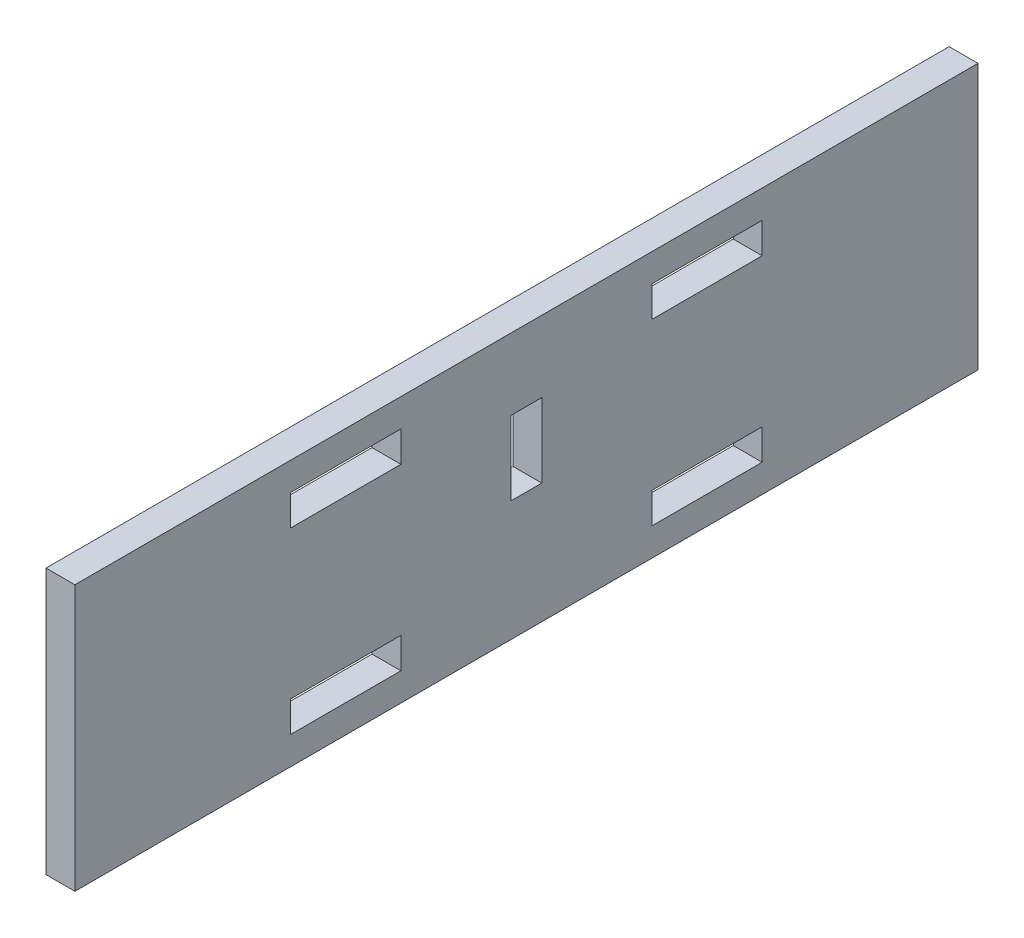
ISO-10303-21;
HEADER;
FILE_DESCRIPTION(('STEP AP214'),'2;1');
FILE_NAME('part.step','',(''),(''),'','','');
FILE_SCHEMA(('AUTOMOTIVE_DESIGN { 1 0 10303 214 1 1 1 1 }'));
ENDSEC;
DATA;
#1=APPLICATION_CONTEXT('core data for automotive mechanical design processes');
#2=APPLICATION_PROTOCOL_DEFINITION('international standard','automotive_design',2000,#1);
#3=PRODUCT_CONTEXT('',#1,'mechanical');
#4=PRODUCT('Part','Part','',(#3));
#5=PRODUCT_RELATED_PRODUCT_CATEGORY('part','',(#4));
#6=PRODUCT_DEFINITION_FORMATION('','',#4);
#7=PRODUCT_DEFINITION_CONTEXT('part definition',#1,'design');
#8=PRODUCT_DEFINITION('design','',#6,#7);
#9=PRODUCT_DEFINITION_SHAPE('','',#8);
#10=(LENGTH_UNIT() NAMED_UNIT(*) SI_UNIT(.MILLI.,.METRE.));
#11=(NAMED_UNIT(*) PLANE_ANGLE_UNIT() SI_UNIT($,.RADIAN.));
#12=(NAMED_UNIT(*) SI_UNIT($,.STERADIAN.) SOLID_ANGLE_UNIT());
#13=UNCERTAINTY_MEASURE_WITH_UNIT(LENGTH_MEASURE(1.E-05),#10,'distance_accuracy_value','');
#14=(GEOMETRIC_REPRESENTATION_CONTEXT(3) GLOBAL_UNCERTAINTY_ASSIGNED_CONTEXT((#13)) GLOBAL_UNIT_ASSIGNED_CONTEXT((#10,
#11,#12)) REPRESENTATION_CONTEXT('',''));
#15=CARTESIAN_POINT('',(0.,0.,0.));
#16=DIRECTION('',(0.,0.,1.));
#17=DIRECTION('',(1.,0.,0.));
#18=AXIS2_PLACEMENT_3D('',#15,#16,#17);
#19=CARTESIAN_POINT('',(-342.5,-16.,125.));
#20=DIRECTION('',(0.,0.,-1.));
#21=DIRECTION('',(1.,0.,0.));
#22=AXIS2_PLACEMENT_3D('',#19,#20,#21);
#23=PLANE('',#22);
#24=DIRECTION('',(0.,-1.,0.));
#25=VECTOR('',#24,1.);
#26=CARTESIAN_POINT('',(-334.5,-16.,125.));
#27=LINE('',#26,#25);
#28=CARTESIAN_POINT('',(-334.5,57.5,125.));
#29=VERTEX_POINT('',#28);
#30=CARTESIAN_POINT('',(-334.5,-16.,125.));
#31=VERTEX_POINT('',#30);
#32=EDGE_CURVE('E301',#29,#31,#27,.T.);
#33=ORIENTED_EDGE('',*,*,#32,.F.);
#34=DIRECTION('',(1.,0.,0.));
#35=VECTOR('',#34,1.);
#36=CARTESIAN_POINT('',(-342.5,57.5,125.));
#37=LINE('',#36,#35);
#38=CARTESIAN_POINT('',(-342.5,57.5,125.));
#39=VERTEX_POINT('',#38);
#40=EDGE_CURVE('E319',#39,#29,#37,.T.);
#41=ORIENTED_EDGE('',*,*,#40,.F.);
#42=DIRECTION('',(0.,-1.,0.));
#43=VECTOR('',#42,1.);
#44=CARTESIAN_POINT('',(-342.5,-16.,125.));
#45=LINE('',#44,#43);
#46=CARTESIAN_POINT('',(-342.5,-16.,125.));
#47=VERTEX_POINT('',#46);
#48=EDGE_CURVE('E307',#39,#47,#45,.T.);
#49=ORIENTED_EDGE('',*,*,#48,.T.);
#50=DIRECTION('',(1.,0.,0.));
#51=VECTOR('',#50,1.);
#52=CARTESIAN_POINT('',(-342.5,-16.,125.));
#53=LINE('',#52,#51);
#54=EDGE_CURVE('E337',#47,#31,#53,.T.);
#55=ORIENTED_EDGE('',*,*,#54,.T.);
#56=EDGE_LOOP('',(#33,#41,#49,#55));
#57=FACE_BOUND('',#56,.T.);
#58=ADVANCED_FACE('F38',(#57),#23,.F.);
#59=CARTESIAN_POINT('',(-342.5,-16.,125.));
#60=DIRECTION('',(0.,1.,0.));
#61=DIRECTION('',(0.,0.,1.));
#62=AXIS2_PLACEMENT_3D('',#59,#60,#61);
#63=PLANE('',#62);
#64=DIRECTION('',(0.,0.,-1.));
#65=VECTOR('',#64,1.);
#66=CARTESIAN_POINT('',(-334.5,-16.,125.));
#67=LINE('',#66,#65);
#68=CARTESIAN_POINT('',(-334.5,-16.,-125.));
#69=VERTEX_POINT('',#68);
#70=EDGE_CURVE('E322',#31,#69,#67,.T.);
#71=ORIENTED_EDGE('',*,*,#70,.F.);
#72=ORIENTED_EDGE('',*,*,#54,.F.);
#73=DIRECTION('',(0.,0.,-1.));
#74=VECTOR('',#73,1.);
#75=CARTESIAN_POINT('',(-342.5,-16.,125.));
#76=LINE('',#75,#74);
#77=CARTESIAN_POINT('',(-342.5,-16.,-125.));
#78=VERTEX_POINT('',#77);
#79=EDGE_CURVE('E310',#47,#78,#76,.T.);
#80=ORIENTED_EDGE('',*,*,#79,.T.);
#81=DIRECTION('',(1.,0.,0.));
#82=VECTOR('',#81,1.);
#83=CARTESIAN_POINT('',(-342.5,-16.,-125.));
#84=LINE('',#83,#82);
#85=EDGE_CURVE('E334',#78,#69,#84,.T.);
#86=ORIENTED_EDGE('',*,*,#85,.T.);
#87=EDGE_LOOP('',(#71,#72,#80,#86));
#88=FACE_BOUND('',#87,.T.);
#89=ADVANCED_FACE('F412',(#88),#63,.F.);
#90=CARTESIAN_POINT('',(-342.5,-16.,-125.));
#91=DIRECTION('',(0.,0.,1.));
#92=DIRECTION('',(-1.,0.,0.));
#93=AXIS2_PLACEMENT_3D('',#90,#91,#92);
#94=PLANE('',#93);
#95=DIRECTION('',(0.,1.,0.));
#96=VECTOR('',#95,1.);
#97=CARTESIAN_POINT('',(-334.5,-16.,-125.));
#98=LINE('',#97,#96);
#99=CARTESIAN_POINT('',(-334.5,57.5,-125.));
#100=VERTEX_POINT('',#99);
#101=EDGE_CURVE('E325',#69,#100,#98,.T.);
#102=ORIENTED_EDGE('',*,*,#101,.F.);
#103=ORIENTED_EDGE('',*,*,#85,.F.);
#104=DIRECTION('',(0.,1.,0.));
#105=VECTOR('',#104,1.);
#106=CARTESIAN_POINT('',(-342.5,-16.,-125.));
#107=LINE('',#106,#105);
#108=CARTESIAN_POINT('',(-342.5,57.5,-125.));
#109=VERTEX_POINT('',#108);
#110=EDGE_CURVE('E314',#78,#109,#107,.T.);
#111=ORIENTED_EDGE('',*,*,#110,.T.);
#112=DIRECTION('',(1.,0.,0.));
#113=VECTOR('',#112,1.);
#114=CARTESIAN_POINT('',(-342.5,57.5,-125.));
#115=LINE('',#114,#113);
#116=EDGE_CURVE('E331',#109,#100,#115,.T.);
#117=ORIENTED_EDGE('',*,*,#116,.T.);
#118=EDGE_LOOP('',(#102,#103,#111,#117));
#119=FACE_BOUND('',#118,.T.);
#120=ADVANCED_FACE('F417',(#119),#94,.F.);
#121=CARTESIAN_POINT('',(-342.5,57.5,125.));
#122=DIRECTION('',(0.,-1.,0.));
#123=DIRECTION('',(0.,0.,-1.));
#124=AXIS2_PLACEMENT_3D('',#121,#122,#123);
#125=PLANE('',#124);
#126=DIRECTION('',(0.,0.,1.));
#127=VECTOR('',#126,1.);
#128=CARTESIAN_POINT('',(-334.5,57.5,125.));
#129=LINE('',#128,#127);
#130=EDGE_CURVE('E311',#100,#29,#129,.T.);
#131=ORIENTED_EDGE('',*,*,#130,.F.);
#132=ORIENTED_EDGE('',*,*,#116,.F.);
#133=DIRECTION('',(0.,0.,1.));
#134=VECTOR('',#133,1.);
#135=CARTESIAN_POINT('',(-342.5,57.5,125.));
#136=LINE('',#135,#134);
#137=EDGE_CURVE('E317',#109,#39,#136,.T.);
#138=ORIENTED_EDGE('',*,*,#137,.T.);
#139=ORIENTED_EDGE('',*,*,#40,.T.);
#140=EDGE_LOOP('',(#131,#132,#138,#139));
#141=FACE_BOUND('',#140,.T.);
#142=ADVANCED_FACE('F425',(#141),#125,.F.);
#143=CARTESIAN_POINT('',(-342.5,0.,0.));
#144=DIRECTION('',(1.,0.,0.));
#145=DIRECTION('',(0.,0.,1.));
#146=AXIS2_PLACEMENT_3D('',#143,#144,#145);
#147=PLANE('',#146);
#148=DIRECTION('',(0.,0.,1.));
#149=VECTOR('',#148,1.);
#150=CARTESIAN_POINT('',(-342.5,37.75,-4.25));
#151=LINE('',#150,#149);
#152=CARTESIAN_POINT('',(-342.5,37.75,-4.25));
#153=VERTEX_POINT('',#152);
#154=CARTESIAN_POINT('',(-342.5,37.75,4.25));
#155=VERTEX_POINT('',#154);
#156=EDGE_CURVE('E201',#153,#155,#151,.T.);
#157=ORIENTED_EDGE('',*,*,#156,.T.);
#158=DIRECTION('',(0.,-1.,0.));
#159=VECTOR('',#158,1.);
#160=CARTESIAN_POINT('',(-342.5,17.25,4.25));
#161=LINE('',#160,#159);
#162=CARTESIAN_POINT('',(-342.5,17.25,4.25));
#163=VERTEX_POINT('',#162);
#164=EDGE_CURVE('E208',#155,#163,#161,.T.);
#165=ORIENTED_EDGE('',*,*,#164,.T.);
#166=DIRECTION('',(0.,0.,-1.));
#167=VECTOR('',#166,1.);
#168=CARTESIAN_POINT('',(-342.5,17.25,-4.25));
#169=LINE('',#168,#167);
#170=CARTESIAN_POINT('',(-342.5,17.25,-4.25));
#171=VERTEX_POINT('',#170);
#172=EDGE_CURVE('E213',#163,#171,#169,.T.);
#173=ORIENTED_EDGE('',*,*,#172,.T.);
#174=DIRECTION('',(0.,1.,0.));
#175=VECTOR('',#174,1.);
#176=CARTESIAN_POINT('',(-342.5,17.25,-4.25));
#177=LINE('',#176,#175);
#178=EDGE_CURVE('E217',#171,#153,#177,.T.);
#179=ORIENTED_EDGE('',*,*,#178,.T.);
#180=EDGE_LOOP('',(#157,#165,#173,#179));
#181=FACE_BOUND('',#180,.T.);
#182=DIRECTION('',(0.,1.,0.));
#183=VECTOR('',#182,1.);
#184=CARTESIAN_POINT('',(-342.5,41.25,34.75));
#185=LINE('',#184,#183);
#186=CARTESIAN_POINT('',(-342.5,41.25,34.75));
#187=VERTEX_POINT('',#186);
#188=CARTESIAN_POINT('',(-342.5,49.75,34.75));
#189=VERTEX_POINT('',#188);
#190=EDGE_CURVE('E229',#187,#189,#185,.T.);
#191=ORIENTED_EDGE('',*,*,#190,.T.);
#192=DIRECTION('',(0.,0.,1.));
#193=VECTOR('',#192,1.);
#194=CARTESIAN_POINT('',(-342.5,49.75,65.25));
#195=LINE('',#194,#193);
#196=CARTESIAN_POINT('',(-342.5,49.75,65.25));
#197=VERTEX_POINT('',#196);
#198=EDGE_CURVE('E232',#189,#197,#195,.T.);
#199=ORIENTED_EDGE('',*,*,#198,.T.);
#200=DIRECTION('',(0.,-1.,0.));
#201=VECTOR('',#200,1.);
#202=CARTESIAN_POINT('',(-342.5,41.25,65.25));
#203=LINE('',#202,#201);
#204=CARTESIAN_POINT('',(-342.5,41.25,65.25));
#205=VERTEX_POINT('',#204);
#206=EDGE_CURVE('E235',#197,#205,#203,.T.);
#207=ORIENTED_EDGE('',*,*,#206,.T.);
#208=DIRECTION('',(0.,0.,-1.));
#209=VECTOR('',#208,1.);
#210=CARTESIAN_POINT('',(-342.5,41.25,65.25));
#211=LINE('',#210,#209);
#212=EDGE_CURVE('E224',#205,#187,#211,.T.);
#213=ORIENTED_EDGE('',*,*,#212,.T.);
#214=EDGE_LOOP('',(#191,#199,#207,#213));
#215=FACE_BOUND('',#214,.T.);
#216=DIRECTION('',(0.,0.,1.));
#217=VECTOR('',#216,1.);
#218=CARTESIAN_POINT('',(-342.5,49.75,-65.25));
#219=LINE('',#218,#217);
#220=CARTESIAN_POINT('',(-342.5,49.75,-65.25));
#221=VERTEX_POINT('',#220);
#222=CARTESIAN_POINT('',(-342.5,49.75,-34.75));
#223=VERTEX_POINT('',#222);
#224=EDGE_CURVE('E249',#221,#223,#219,.T.);
#225=ORIENTED_EDGE('',*,*,#224,.T.);
#226=DIRECTION('',(0.,-1.,0.));
#227=VECTOR('',#226,1.);
#228=CARTESIAN_POINT('',(-342.5,41.25,-34.75));
#229=LINE('',#228,#227);
#230=CARTESIAN_POINT('',(-342.5,41.25,-34.75));
#231=VERTEX_POINT('',#230);
#232=EDGE_CURVE('E252',#223,#231,#229,.T.);
#233=ORIENTED_EDGE('',*,*,#232,.T.);
#234=DIRECTION('',(0.,0.,-1.));
#235=VECTOR('',#234,1.);
#236=CARTESIAN_POINT('',(-342.5,41.25,-65.25));
#237=LINE('',#236,#235);
#238=CARTESIAN_POINT('',(-342.5,41.25,-65.25));
#239=VERTEX_POINT('',#238);
#240=EDGE_CURVE('E255',#231,#239,#237,.T.);
#241=ORIENTED_EDGE('',*,*,#240,.T.);
#242=DIRECTION('',(0.,1.,0.));
#243=VECTOR('',#242,1.);
#244=CARTESIAN_POINT('',(-342.5,41.25,-65.25));
#245=LINE('',#244,#243);
#246=EDGE_CURVE('E241',#239,#221,#245,.T.);
#247=ORIENTED_EDGE('',*,*,#246,.T.);
#248=EDGE_LOOP('',(#225,#233,#241,#247));
#249=FACE_BOUND('',#248,.T.);
#250=DIRECTION('',(0.,-1.,0.));
#251=VECTOR('',#250,1.);
#252=CARTESIAN_POINT('',(-342.5,0.25000000000002,-34.75));
#253=LINE('',#252,#251);
#254=CARTESIAN_POINT('',(-342.5,0.25000000000002,-34.75));
#255=VERTEX_POINT('',#254);
#256=CARTESIAN_POINT('',(-342.5,-8.24999999999998,-34.75));
#257=VERTEX_POINT('',#256);
#258=EDGE_CURVE('E269',#255,#257,#253,.T.);
#259=ORIENTED_EDGE('',*,*,#258,.T.);
#260=DIRECTION('',(0.,0.,-1.));
#261=VECTOR('',#260,1.);
#262=CARTESIAN_POINT('',(-342.5,-8.24999999999999,-65.25));
#263=LINE('',#262,#261);
#264=CARTESIAN_POINT('',(-342.5,-8.24999999999999,-65.25));
#265=VERTEX_POINT('',#264);
#266=EDGE_CURVE('E272',#257,#265,#263,.T.);
#267=ORIENTED_EDGE('',*,*,#266,.T.);
#268=DIRECTION('',(0.,1.,0.));
#269=VECTOR('',#268,1.);
#270=CARTESIAN_POINT('',(-342.5,0.250000000000012,-65.25));
#271=LINE('',#270,#269);
#272=CARTESIAN_POINT('',(-342.5,0.250000000000012,-65.25));
#273=VERTEX_POINT('',#272);
#274=EDGE_CURVE('E275',#265,#273,#271,.T.);
#275=ORIENTED_EDGE('',*,*,#274,.T.);
#276=DIRECTION('',(0.,0.,1.));
#277=VECTOR('',#276,1.);
#278=CARTESIAN_POINT('',(-342.5,0.250000000000012,-65.25));
#279=LINE('',#278,#277);
#280=EDGE_CURVE('E261',#273,#255,#279,.T.);
#281=ORIENTED_EDGE('',*,*,#280,.T.);
#282=EDGE_LOOP('',(#259,#267,#275,#281));
#283=FACE_BOUND('',#282,.T.);
#284=DIRECTION('',(0.,-1.,0.));
#285=VECTOR('',#284,1.);
#286=CARTESIAN_POINT('',(-342.5,0.250000000000021,65.25));
#287=LINE('',#286,#285);
#288=CARTESIAN_POINT('',(-342.5,0.250000000000021,65.25));
#289=VERTEX_POINT('',#288);
#290=CARTESIAN_POINT('',(-342.5,-8.24999999999998,65.25));
#291=VERTEX_POINT('',#290);
#292=EDGE_CURVE('E289',#289,#291,#287,.T.);
#293=ORIENTED_EDGE('',*,*,#292,.T.);
#294=DIRECTION('',(0.,0.,-1.));
#295=VECTOR('',#294,1.);
#296=CARTESIAN_POINT('',(-342.5,-8.24999999999998,65.25));
#297=LINE('',#296,#295);
#298=CARTESIAN_POINT('',(-342.5,-8.24999999999998,34.75));
#299=VERTEX_POINT('',#298);
#300=EDGE_CURVE('E292',#291,#299,#297,.T.);
#301=ORIENTED_EDGE('',*,*,#300,.T.);
#302=DIRECTION('',(0.,1.,0.));
#303=VECTOR('',#302,1.);
#304=CARTESIAN_POINT('',(-342.5,0.250000000000025,34.75));
#305=LINE('',#304,#303);
#306=CARTESIAN_POINT('',(-342.5,0.250000000000025,34.75));
#307=VERTEX_POINT('',#306);
#308=EDGE_CURVE('E295',#299,#307,#305,.T.);
#309=ORIENTED_EDGE('',*,*,#308,.T.);
#310=DIRECTION('',(0.,0.,1.));
#311=VECTOR('',#310,1.);
#312=CARTESIAN_POINT('',(-342.5,0.250000000000021,65.25));
#313=LINE('',#312,#311);
#314=EDGE_CURVE('E281',#307,#289,#313,.T.);
#315=ORIENTED_EDGE('',*,*,#314,.T.);
#316=EDGE_LOOP('',(#293,#301,#309,#315));
#317=FACE_BOUND('',#316,.T.);
#318=ORIENTED_EDGE('',*,*,#48,.F.);
#319=ORIENTED_EDGE('',*,*,#137,.F.);
#320=ORIENTED_EDGE('',*,*,#110,.F.);
#321=ORIENTED_EDGE('',*,*,#79,.F.);
#322=EDGE_LOOP('',(#318,#319,#320,#321));
#323=FACE_BOUND('',#322,.T.);
#324=ADVANCED_FACE('F215',(#181,#215,#249,#283,#317,#323),#147,.F.);
#325=CARTESIAN_POINT('',(-334.5,0.,0.));
#326=DIRECTION('',(1.,0.,0.));
#327=DIRECTION('',(0.,0.,1.));
#328=AXIS2_PLACEMENT_3D('',#325,#326,#327);
#329=PLANE('',#328);
#330=DIRECTION('',(0.,-1.,0.));
#331=VECTOR('',#330,1.);
#332=CARTESIAN_POINT('',(-334.5,0.,-4.25));
#333=LINE('',#332,#331);
#334=CARTESIAN_POINT('',(-334.5,37.75,-4.25));
#335=VERTEX_POINT('',#334);
#336=CARTESIAN_POINT('',(-334.5,17.25,-4.25));
#337=VERTEX_POINT('',#336);
#338=EDGE_CURVE('E11',#335,#337,#333,.T.);
#339=ORIENTED_EDGE('',*,*,#338,.T.);
#340=DIRECTION('',(0.,0.,1.));
#341=VECTOR('',#340,1.);
#342=CARTESIAN_POINT('',(-334.5,17.25,0.));
#343=LINE('',#342,#341);
#344=CARTESIAN_POINT('',(-334.5,17.25,4.25));
#345=VERTEX_POINT('',#344);
#346=EDGE_CURVE('E45',#337,#345,#343,.T.);
#347=ORIENTED_EDGE('',*,*,#346,.T.);
#348=DIRECTION('',(0.,1.,0.));
#349=VECTOR('',#348,1.);
#350=CARTESIAN_POINT('',(-334.5,0.,4.25));
#351=LINE('',#350,#349);
#352=CARTESIAN_POINT('',(-334.5,37.75,4.25));
#353=VERTEX_POINT('',#352);
#354=EDGE_CURVE('E389',#345,#353,#351,.T.);
#355=ORIENTED_EDGE('',*,*,#354,.T.);
#356=DIRECTION('',(0.,0.,-1.));
#357=VECTOR('',#356,1.);
#358=CARTESIAN_POINT('',(-334.5,37.75,0.));
#359=LINE('',#358,#357);
#360=EDGE_CURVE('E203',#353,#335,#359,.T.);
#361=ORIENTED_EDGE('',*,*,#360,.T.);
#362=EDGE_LOOP('',(#339,#347,#355,#361));
#363=FACE_BOUND('',#362,.T.);
#364=DIRECTION('',(0.,0.,1.));
#365=VECTOR('',#364,1.);
#366=CARTESIAN_POINT('',(-334.5,41.25,0.));
#367=LINE('',#366,#365);
#368=CARTESIAN_POINT('',(-334.5,41.25,34.75));
#369=VERTEX_POINT('',#368);
#370=CARTESIAN_POINT('',(-334.5,41.25,65.25));
#371=VERTEX_POINT('',#370);
#372=EDGE_CURVE('E385',#369,#371,#367,.T.);
#373=ORIENTED_EDGE('',*,*,#372,.T.);
#374=DIRECTION('',(0.,1.,0.));
#375=VECTOR('',#374,1.);
#376=CARTESIAN_POINT('',(-334.5,0.,65.25));
#377=LINE('',#376,#375);
#378=CARTESIAN_POINT('',(-334.5,49.75,65.25));
#379=VERTEX_POINT('',#378);
#380=EDGE_CURVE('E382',#371,#379,#377,.T.);
#381=ORIENTED_EDGE('',*,*,#380,.T.);
#382=DIRECTION('',(0.,0.,-1.));
#383=VECTOR('',#382,1.);
#384=CARTESIAN_POINT('',(-334.5,49.75,0.));
#385=LINE('',#384,#383);
#386=CARTESIAN_POINT('',(-334.5,49.75,34.75));
#387=VERTEX_POINT('',#386);
#388=EDGE_CURVE('E379',#379,#387,#385,.T.);
#389=ORIENTED_EDGE('',*,*,#388,.T.);
#390=DIRECTION('',(0.,-1.,0.));
#391=VECTOR('',#390,1.);
#392=CARTESIAN_POINT('',(-334.5,0.,34.75));
#393=LINE('',#392,#391);
#394=EDGE_CURVE('E376',#387,#369,#393,.T.);
#395=ORIENTED_EDGE('',*,*,#394,.T.);
#396=EDGE_LOOP('',(#373,#381,#389,#395));
#397=FACE_BOUND('',#396,.T.);
#398=DIRECTION('',(0.,-1.,0.));
#399=VECTOR('',#398,1.);
#400=CARTESIAN_POINT('',(-334.5,0.,-65.25));
#401=LINE('',#400,#399);
#402=CARTESIAN_POINT('',(-334.5,49.75,-65.25));
#403=VERTEX_POINT('',#402);
#404=CARTESIAN_POINT('',(-334.5,41.25,-65.25));
#405=VERTEX_POINT('',#404);
#406=EDGE_CURVE('E373',#403,#405,#401,.T.);
#407=ORIENTED_EDGE('',*,*,#406,.T.);
#408=DIRECTION('',(0.,0.,1.));
#409=VECTOR('',#408,1.);
#410=CARTESIAN_POINT('',(-334.5,41.25,0.));
#411=LINE('',#410,#409);
#412=CARTESIAN_POINT('',(-334.5,41.25,-34.75));
#413=VERTEX_POINT('',#412);
#414=EDGE_CURVE('E370',#405,#413,#411,.T.);
#415=ORIENTED_EDGE('',*,*,#414,.T.);
#416=DIRECTION('',(0.,1.,0.));
#417=VECTOR('',#416,1.);
#418=CARTESIAN_POINT('',(-334.5,0.,-34.75));
#419=LINE('',#418,#417);
#420=CARTESIAN_POINT('',(-334.5,49.75,-34.75));
#421=VERTEX_POINT('',#420);
#422=EDGE_CURVE('E367',#413,#421,#419,.T.);
#423=ORIENTED_EDGE('',*,*,#422,.T.);
#424=DIRECTION('',(0.,0.,-1.));
#425=VECTOR('',#424,1.);
#426=CARTESIAN_POINT('',(-334.5,49.75,0.));
#427=LINE('',#426,#425);
#428=EDGE_CURVE('E364',#421,#403,#427,.T.);
#429=ORIENTED_EDGE('',*,*,#428,.T.);
#430=EDGE_LOOP('',(#407,#415,#423,#429));
#431=FACE_BOUND('',#430,.T.);
#432=DIRECTION('',(0.,0.,-1.));
#433=VECTOR('',#432,1.);
#434=CARTESIAN_POINT('',(-334.5,0.250000000000028,0.));
#435=LINE('',#434,#433);
#436=CARTESIAN_POINT('',(-334.5,0.25000000000002,-34.75));
#437=VERTEX_POINT('',#436);
#438=CARTESIAN_POINT('',(-334.5,0.250000000000012,-65.25));
#439=VERTEX_POINT('',#438);
#440=EDGE_CURVE('E361',#437,#439,#435,.T.);
#441=ORIENTED_EDGE('',*,*,#440,.T.);
#442=DIRECTION('',(0.,-1.,0.));
#443=VECTOR('',#442,1.);
#444=CARTESIAN_POINT('',(-334.5,0.,-65.25));
#445=LINE('',#444,#443);
#446=CARTESIAN_POINT('',(-334.5,-8.24999999999999,-65.25));
#447=VERTEX_POINT('',#446);
#448=EDGE_CURVE('E358',#439,#447,#445,.T.);
#449=ORIENTED_EDGE('',*,*,#448,.T.);
#450=DIRECTION('',(0.,0.,1.));
#451=VECTOR('',#450,1.);
#452=CARTESIAN_POINT('',(-334.5,-8.24999999999996,0.));
#453=LINE('',#452,#451);
#454=CARTESIAN_POINT('',(-334.5,-8.24999999999998,-34.75));
#455=VERTEX_POINT('',#454);
#456=EDGE_CURVE('E355',#447,#455,#453,.T.);
#457=ORIENTED_EDGE('',*,*,#456,.T.);
#458=DIRECTION('',(0.,1.,0.));
#459=VECTOR('',#458,1.);
#460=CARTESIAN_POINT('',(-334.5,0.,-34.75));
#461=LINE('',#460,#459);
#462=EDGE_CURVE('E352',#455,#437,#461,.T.);
#463=ORIENTED_EDGE('',*,*,#462,.T.);
#464=EDGE_LOOP('',(#441,#449,#457,#463));
#465=FACE_BOUND('',#464,.T.);
#466=DIRECTION('',(0.,0.,-1.));
#467=VECTOR('',#466,1.);
#468=CARTESIAN_POINT('',(-334.5,0.250000000000028,0.));
#469=LINE('',#468,#467);
#470=CARTESIAN_POINT('',(-334.5,0.250000000000021,65.25));
#471=VERTEX_POINT('',#470);
#472=CARTESIAN_POINT('',(-334.5,0.250000000000025,34.75));
#473=VERTEX_POINT('',#472);
#474=EDGE_CURVE('E349',#471,#473,#469,.T.);
#475=ORIENTED_EDGE('',*,*,#474,.T.);
#476=DIRECTION('',(0.,-1.,0.));
#477=VECTOR('',#476,1.);
#478=CARTESIAN_POINT('',(-334.5,0.,34.75));
#479=LINE('',#478,#477);
#480=CARTESIAN_POINT('',(-334.5,-8.24999999999998,34.75));
#481=VERTEX_POINT('',#480);
#482=EDGE_CURVE('E346',#473,#481,#479,.T.);
#483=ORIENTED_EDGE('',*,*,#482,.T.);
#484=DIRECTION('',(0.,0.,1.));
#485=VECTOR('',#484,1.);
#486=CARTESIAN_POINT('',(-334.5,-8.24999999999998,0.));
#487=LINE('',#486,#485);
#488=CARTESIAN_POINT('',(-334.5,-8.24999999999998,65.25));
#489=VERTEX_POINT('',#488);
#490=EDGE_CURVE('E343',#481,#489,#487,.T.);
#491=ORIENTED_EDGE('',*,*,#490,.T.);
#492=DIRECTION('',(0.,1.,0.));
#493=VECTOR('',#492,1.);
#494=CARTESIAN_POINT('',(-334.5,0.,65.25));
#495=LINE('',#494,#493);
#496=EDGE_CURVE('E340',#489,#471,#495,.T.);
#497=ORIENTED_EDGE('',*,*,#496,.T.);
#498=EDGE_LOOP('',(#475,#483,#491,#497));
#499=FACE_BOUND('',#498,.T.);
#500=ORIENTED_EDGE('',*,*,#32,.T.);
#501=ORIENTED_EDGE('',*,*,#70,.T.);
#502=ORIENTED_EDGE('',*,*,#101,.T.);
#503=ORIENTED_EDGE('',*,*,#130,.T.);
#504=EDGE_LOOP('',(#500,#501,#502,#503));
#505=FACE_BOUND('',#504,.T.);
#506=ADVANCED_FACE('F393',(#363,#397,#431,#465,#499,#505),#329,.T.);
#507=CARTESIAN_POINT('',(342.5,0.250000000000021,65.25));
#508=DIRECTION('',(0.,1.,0.));
#509=DIRECTION('',(0.,0.,1.));
#510=AXIS2_PLACEMENT_3D('',#507,#508,#509);
#511=PLANE('',#510);
#512=ORIENTED_EDGE('',*,*,#474,.F.);
#513=DIRECTION('',(-1.,0.,0.));
#514=VECTOR('',#513,1.);
#515=CARTESIAN_POINT('',(342.5,0.250000000000021,65.25));
#516=LINE('',#515,#514);
#517=EDGE_CURVE('E298',#471,#289,#516,.T.);
#518=ORIENTED_EDGE('',*,*,#517,.T.);
#519=ORIENTED_EDGE('',*,*,#314,.F.);
#520=DIRECTION('',(-1.,0.,0.));
#521=VECTOR('',#520,1.);
#522=CARTESIAN_POINT('',(342.5,0.250000000000025,34.75));
#523=LINE('',#522,#521);
#524=EDGE_CURVE('E299',#473,#307,#523,.T.);
#525=ORIENTED_EDGE('',*,*,#524,.F.);
#526=EDGE_LOOP('',(#512,#518,#519,#525));
#527=FACE_BOUND('',#526,.T.);
#528=ADVANCED_FACE('F439',(#527),#511,.F.);
#529=CARTESIAN_POINT('',(342.5,0.250000000000025,34.75));
#530=DIRECTION('',(0.,0.,-1.));
#531=DIRECTION('',(1.,0.,0.));
#532=AXIS2_PLACEMENT_3D('',#529,#530,#531);
#533=PLANE('',#532);
#534=ORIENTED_EDGE('',*,*,#482,.F.);
#535=ORIENTED_EDGE('',*,*,#524,.T.);
#536=ORIENTED_EDGE('',*,*,#308,.F.);
#537=DIRECTION('',(-1.,0.,0.));
#538=VECTOR('',#537,1.);
#539=CARTESIAN_POINT('',(342.5,-8.24999999999998,34.75));
#540=LINE('',#539,#538);
#541=EDGE_CURVE('E302',#481,#299,#540,.T.);
#542=ORIENTED_EDGE('',*,*,#541,.F.);
#543=EDGE_LOOP('',(#534,#535,#536,#542));
#544=FACE_BOUND('',#543,.T.);
#545=ADVANCED_FACE('F444',(#544),#533,.F.);
#546=CARTESIAN_POINT('',(342.5,-8.24999999999998,65.25));
#547=DIRECTION('',(0.,-1.,0.));
#548=DIRECTION('',(0.,0.,-1.));
#549=AXIS2_PLACEMENT_3D('',#546,#547,#548);
#550=PLANE('',#549);
#551=ORIENTED_EDGE('',*,*,#490,.F.);
#552=ORIENTED_EDGE('',*,*,#541,.T.);
#553=ORIENTED_EDGE('',*,*,#300,.F.);
#554=DIRECTION('',(-1.,0.,0.));
#555=VECTOR('',#554,1.);
#556=CARTESIAN_POINT('',(342.5,-8.24999999999998,65.25));
#557=LINE('',#556,#555);
#558=EDGE_CURVE('E304',#489,#291,#557,.T.);
#559=ORIENTED_EDGE('',*,*,#558,.F.);
#560=EDGE_LOOP('',(#551,#552,#553,#559));
#561=FACE_BOUND('',#560,.T.);
#562=ADVANCED_FACE('F450',(#561),#550,.F.);
#563=CARTESIAN_POINT('',(342.5,0.250000000000021,65.25));
#564=DIRECTION('',(0.,0.,1.));
#565=DIRECTION('',(-1.,0.,0.));
#566=AXIS2_PLACEMENT_3D('',#563,#564,#565);
#567=PLANE('',#566);
#568=ORIENTED_EDGE('',*,*,#496,.F.);
#569=ORIENTED_EDGE('',*,*,#558,.T.);
#570=ORIENTED_EDGE('',*,*,#292,.F.);
#571=ORIENTED_EDGE('',*,*,#517,.F.);
#572=EDGE_LOOP('',(#568,#569,#570,#571));
#573=FACE_BOUND('',#572,.T.);
#574=ADVANCED_FACE('F446',(#573),#567,.F.);
#575=CARTESIAN_POINT('',(342.5,0.250000000000012,-65.25));
#576=DIRECTION('',(0.,1.,0.));
#577=DIRECTION('',(0.,0.,1.));
#578=AXIS2_PLACEMENT_3D('',#575,#576,#577);
#579=PLANE('',#578);
#580=ORIENTED_EDGE('',*,*,#440,.F.);
#581=DIRECTION('',(-1.,0.,0.));
#582=VECTOR('',#581,1.);
#583=CARTESIAN_POINT('',(342.5,0.25000000000002,-34.75));
#584=LINE('',#583,#582);
#585=EDGE_CURVE('E278',#437,#255,#584,.T.);
#586=ORIENTED_EDGE('',*,*,#585,.T.);
#587=ORIENTED_EDGE('',*,*,#280,.F.);
#588=DIRECTION('',(-1.,0.,0.));
#589=VECTOR('',#588,1.);
#590=CARTESIAN_POINT('',(342.5,0.250000000000012,-65.25));
#591=LINE('',#590,#589);
#592=EDGE_CURVE('E279',#439,#273,#591,.T.);
#593=ORIENTED_EDGE('',*,*,#592,.F.);
#594=EDGE_LOOP('',(#580,#586,#587,#593));
#595=FACE_BOUND('',#594,.T.);
#596=ADVANCED_FACE('F449',(#595),#579,.F.);
#597=CARTESIAN_POINT('',(342.5,0.250000000000012,-65.25));
#598=DIRECTION('',(0.,0.,-1.));
#599=DIRECTION('',(1.,0.,0.));
#600=AXIS2_PLACEMENT_3D('',#597,#598,#599);
#601=PLANE('',#600);
#602=ORIENTED_EDGE('',*,*,#448,.F.);
#603=ORIENTED_EDGE('',*,*,#592,.T.);
#604=ORIENTED_EDGE('',*,*,#274,.F.);
#605=DIRECTION('',(-1.,0.,0.));
#606=VECTOR('',#605,1.);
#607=CARTESIAN_POINT('',(342.5,-8.24999999999999,-65.25));
#608=LINE('',#607,#606);
#609=EDGE_CURVE('E282',#447,#265,#608,.T.);
#610=ORIENTED_EDGE('',*,*,#609,.F.);
#611=EDGE_LOOP('',(#602,#603,#604,#610));
#612=FACE_BOUND('',#611,.T.);
#613=ADVANCED_FACE('F460',(#612),#601,.F.);
#614=CARTESIAN_POINT('',(342.5,-8.24999999999999,-65.25));
#615=DIRECTION('',(0.,-1.,0.));
#616=DIRECTION('',(0.,0.,-1.));
#617=AXIS2_PLACEMENT_3D('',#614,#615,#616);
#618=PLANE('',#617);
#619=ORIENTED_EDGE('',*,*,#456,.F.);
#620=ORIENTED_EDGE('',*,*,#609,.T.);
#621=ORIENTED_EDGE('',*,*,#266,.F.);
#622=DIRECTION('',(-1.,0.,0.));
#623=VECTOR('',#622,1.);
#624=CARTESIAN_POINT('',(342.5,-8.24999999999998,-34.75));
#625=LINE('',#624,#623);
#626=EDGE_CURVE('E284',#455,#257,#625,.T.);
#627=ORIENTED_EDGE('',*,*,#626,.F.);
#628=EDGE_LOOP('',(#619,#620,#621,#627));
#629=FACE_BOUND('',#628,.T.);
#630=ADVANCED_FACE('F466',(#629),#618,.F.);
#631=CARTESIAN_POINT('',(342.5,0.25000000000002,-34.75));
#632=DIRECTION('',(0.,0.,1.));
#633=DIRECTION('',(-1.,0.,0.));
#634=AXIS2_PLACEMENT_3D('',#631,#632,#633);
#635=PLANE('',#634);
#636=ORIENTED_EDGE('',*,*,#462,.F.);
#637=ORIENTED_EDGE('',*,*,#626,.T.);
#638=ORIENTED_EDGE('',*,*,#258,.F.);
#639=ORIENTED_EDGE('',*,*,#585,.F.);
#640=EDGE_LOOP('',(#636,#637,#638,#639));
#641=FACE_BOUND('',#640,.T.);
#642=ADVANCED_FACE('F462',(#641),#635,.F.);
#643=CARTESIAN_POINT('',(342.5,41.25,-65.25));
#644=DIRECTION('',(0.,0.,-1.));
#645=DIRECTION('',(1.,0.,0.));
#646=AXIS2_PLACEMENT_3D('',#643,#644,#645);
#647=PLANE('',#646);
#648=ORIENTED_EDGE('',*,*,#406,.F.);
#649=DIRECTION('',(-1.,0.,0.));
#650=VECTOR('',#649,1.);
#651=CARTESIAN_POINT('',(342.5,49.75,-65.25));
#652=LINE('',#651,#650);
#653=EDGE_CURVE('E258',#403,#221,#652,.T.);
#654=ORIENTED_EDGE('',*,*,#653,.T.);
#655=ORIENTED_EDGE('',*,*,#246,.F.);
#656=DIRECTION('',(-1.,0.,0.));
#657=VECTOR('',#656,1.);
#658=CARTESIAN_POINT('',(342.5,41.25,-65.25));
#659=LINE('',#658,#657);
#660=EDGE_CURVE('E259',#405,#239,#659,.T.);
#661=ORIENTED_EDGE('',*,*,#660,.F.);
#662=EDGE_LOOP('',(#648,#654,#655,#661));
#663=FACE_BOUND('',#662,.T.);
#664=ADVANCED_FACE('F465',(#663),#647,.F.);
#665=CARTESIAN_POINT('',(342.5,41.25,-65.25));
#666=DIRECTION('',(0.,-1.,0.));
#667=DIRECTION('',(0.,0.,-1.));
#668=AXIS2_PLACEMENT_3D('',#665,#666,#667);
#669=PLANE('',#668);
#670=ORIENTED_EDGE('',*,*,#414,.F.);
#671=ORIENTED_EDGE('',*,*,#660,.T.);
#672=ORIENTED_EDGE('',*,*,#240,.F.);
#673=DIRECTION('',(-1.,0.,0.));
#674=VECTOR('',#673,1.);
#675=CARTESIAN_POINT('',(342.5,41.25,-34.75));
#676=LINE('',#675,#674);
#677=EDGE_CURVE('E262',#413,#231,#676,.T.);
#678=ORIENTED_EDGE('',*,*,#677,.F.);
#679=EDGE_LOOP('',(#670,#671,#672,#678));
#680=FACE_BOUND('',#679,.T.);
#681=ADVANCED_FACE('F476',(#680),#669,.F.);
#682=CARTESIAN_POINT('',(342.5,41.25,-34.75));
#683=DIRECTION('',(0.,0.,1.));
#684=DIRECTION('',(-1.,0.,0.));
#685=AXIS2_PLACEMENT_3D('',#682,#683,#684);
#686=PLANE('',#685);
#687=ORIENTED_EDGE('',*,*,#422,.F.);
#688=ORIENTED_EDGE('',*,*,#677,.T.);
#689=ORIENTED_EDGE('',*,*,#232,.F.);
#690=DIRECTION('',(-1.,0.,0.));
#691=VECTOR('',#690,1.);
#692=CARTESIAN_POINT('',(342.5,49.75,-34.75));
#693=LINE('',#692,#691);
#694=EDGE_CURVE('E264',#421,#223,#693,.T.);
#695=ORIENTED_EDGE('',*,*,#694,.F.);
#696=EDGE_LOOP('',(#687,#688,#689,#695));
#697=FACE_BOUND('',#696,.T.);
#698=ADVANCED_FACE('F482',(#697),#686,.F.);
#699=CARTESIAN_POINT('',(342.5,49.75,-65.25));
#700=DIRECTION('',(0.,1.,0.));
#701=DIRECTION('',(0.,0.,1.));
#702=AXIS2_PLACEMENT_3D('',#699,#700,#701);
#703=PLANE('',#702);
#704=ORIENTED_EDGE('',*,*,#428,.F.);
#705=ORIENTED_EDGE('',*,*,#694,.T.);
#706=ORIENTED_EDGE('',*,*,#224,.F.);
#707=ORIENTED_EDGE('',*,*,#653,.F.);
#708=EDGE_LOOP('',(#704,#705,#706,#707));
#709=FACE_BOUND('',#708,.T.);
#710=ADVANCED_FACE('F478',(#709),#703,.F.);
#711=CARTESIAN_POINT('',(342.5,41.25,65.25));
#712=DIRECTION('',(0.,-1.,0.));
#713=DIRECTION('',(0.,0.,-1.));
#714=AXIS2_PLACEMENT_3D('',#711,#712,#713);
#715=PLANE('',#714);
#716=ORIENTED_EDGE('',*,*,#372,.F.);
#717=DIRECTION('',(-1.,0.,0.));
#718=VECTOR('',#717,1.);
#719=CARTESIAN_POINT('',(342.5,41.25,34.75));
#720=LINE('',#719,#718);
#721=EDGE_CURVE('E238',#369,#187,#720,.T.);
#722=ORIENTED_EDGE('',*,*,#721,.T.);
#723=ORIENTED_EDGE('',*,*,#212,.F.);
#724=DIRECTION('',(-1.,0.,0.));
#725=VECTOR('',#724,1.);
#726=CARTESIAN_POINT('',(342.5,41.25,65.25));
#727=LINE('',#726,#725);
#728=EDGE_CURVE('E239',#371,#205,#727,.T.);
#729=ORIENTED_EDGE('',*,*,#728,.F.);
#730=EDGE_LOOP('',(#716,#722,#723,#729));
#731=FACE_BOUND('',#730,.T.);
#732=ADVANCED_FACE('F481',(#731),#715,.F.);
#733=CARTESIAN_POINT('',(342.5,41.25,65.25));
#734=DIRECTION('',(0.,0.,1.));
#735=DIRECTION('',(-1.,0.,0.));
#736=AXIS2_PLACEMENT_3D('',#733,#734,#735);
#737=PLANE('',#736);
#738=ORIENTED_EDGE('',*,*,#380,.F.);
#739=ORIENTED_EDGE('',*,*,#728,.T.);
#740=ORIENTED_EDGE('',*,*,#206,.F.);
#741=DIRECTION('',(-1.,0.,0.));
#742=VECTOR('',#741,1.);
#743=CARTESIAN_POINT('',(342.5,49.75,65.25));
#744=LINE('',#743,#742);
#745=EDGE_CURVE('E242',#379,#197,#744,.T.);
#746=ORIENTED_EDGE('',*,*,#745,.F.);
#747=EDGE_LOOP('',(#738,#739,#740,#746));
#748=FACE_BOUND('',#747,.T.);
#749=ADVANCED_FACE('F491',(#748),#737,.F.);
#750=CARTESIAN_POINT('',(342.5,49.75,65.25));
#751=DIRECTION('',(0.,1.,0.));
#752=DIRECTION('',(0.,0.,1.));
#753=AXIS2_PLACEMENT_3D('',#750,#751,#752);
#754=PLANE('',#753);
#755=ORIENTED_EDGE('',*,*,#388,.F.);
#756=ORIENTED_EDGE('',*,*,#745,.T.);
#757=ORIENTED_EDGE('',*,*,#198,.F.);
#758=DIRECTION('',(-1.,0.,0.));
#759=VECTOR('',#758,1.);
#760=CARTESIAN_POINT('',(342.5,49.75,34.75));
#761=LINE('',#760,#759);
#762=EDGE_CURVE('E244',#387,#189,#761,.T.);
#763=ORIENTED_EDGE('',*,*,#762,.F.);
#764=EDGE_LOOP('',(#755,#756,#757,#763));
#765=FACE_BOUND('',#764,.T.);
#766=ADVANCED_FACE('F406',(#765),#754,.F.);
#767=CARTESIAN_POINT('',(342.5,41.25,34.75));
#768=DIRECTION('',(0.,0.,-1.));
#769=DIRECTION('',(1.,0.,0.));
#770=AXIS2_PLACEMENT_3D('',#767,#768,#769);
#771=PLANE('',#770);
#772=ORIENTED_EDGE('',*,*,#394,.F.);
#773=ORIENTED_EDGE('',*,*,#762,.T.);
#774=ORIENTED_EDGE('',*,*,#190,.F.);
#775=ORIENTED_EDGE('',*,*,#721,.F.);
#776=EDGE_LOOP('',(#772,#773,#774,#775));
#777=FACE_BOUND('',#776,.T.);
#778=ADVANCED_FACE('F399',(#777),#771,.F.);
#779=CARTESIAN_POINT('',(-332.5,17.25,-4.25));
#780=DIRECTION('',(0.,0.,-1.));
#781=DIRECTION('',(1.,0.,0.));
#782=AXIS2_PLACEMENT_3D('',#779,#780,#781);
#783=PLANE('',#782);
#784=ORIENTED_EDGE('',*,*,#338,.F.);
#785=DIRECTION('',(-1.,0.,0.));
#786=VECTOR('',#785,1.);
#787=CARTESIAN_POINT('',(-332.5,37.75,-4.25));
#788=LINE('',#787,#786);
#789=EDGE_CURVE('E52',#335,#153,#788,.T.);
#790=ORIENTED_EDGE('',*,*,#789,.T.);
#791=ORIENTED_EDGE('',*,*,#178,.F.);
#792=DIRECTION('',(-1.,0.,0.));
#793=VECTOR('',#792,1.);
#794=CARTESIAN_POINT('',(-332.5,17.25,-4.25));
#795=LINE('',#794,#793);
#796=EDGE_CURVE('E222',#337,#171,#795,.T.);
#797=ORIENTED_EDGE('',*,*,#796,.F.);
#798=EDGE_LOOP('',(#784,#790,#791,#797));
#799=FACE_BOUND('',#798,.T.);
#800=ADVANCED_FACE('F397',(#799),#783,.F.);
#801=CARTESIAN_POINT('',(-332.5,17.25,-4.25));
#802=DIRECTION('',(0.,-1.,0.));
#803=DIRECTION('',(0.,0.,-1.));
#804=AXIS2_PLACEMENT_3D('',#801,#802,#803);
#805=PLANE('',#804);
#806=ORIENTED_EDGE('',*,*,#346,.F.);
#807=ORIENTED_EDGE('',*,*,#796,.T.);
#808=ORIENTED_EDGE('',*,*,#172,.F.);
#809=DIRECTION('',(-1.,0.,0.));
#810=VECTOR('',#809,1.);
#811=CARTESIAN_POINT('',(-332.5,17.25,4.25));
#812=LINE('',#811,#810);
#813=EDGE_CURVE('E205',#345,#163,#812,.T.);
#814=ORIENTED_EDGE('',*,*,#813,.F.);
#815=EDGE_LOOP('',(#806,#807,#808,#814));
#816=FACE_BOUND('',#815,.T.);
#817=ADVANCED_FACE('F396',(#816),#805,.F.);
#818=CARTESIAN_POINT('',(-332.5,17.25,4.25));
#819=DIRECTION('',(0.,0.,1.));
#820=DIRECTION('',(-1.,0.,0.));
#821=AXIS2_PLACEMENT_3D('',#818,#819,#820);
#822=PLANE('',#821);
#823=ORIENTED_EDGE('',*,*,#354,.F.);
#824=ORIENTED_EDGE('',*,*,#813,.T.);
#825=ORIENTED_EDGE('',*,*,#164,.F.);
#826=DIRECTION('',(-1.,0.,0.));
#827=VECTOR('',#826,1.);
#828=CARTESIAN_POINT('',(-332.5,37.75,4.25));
#829=LINE('',#828,#827);
#830=EDGE_CURVE('E60',#353,#155,#829,.T.);
#831=ORIENTED_EDGE('',*,*,#830,.F.);
#832=EDGE_LOOP('',(#823,#824,#825,#831));
#833=FACE_BOUND('',#832,.T.);
#834=ADVANCED_FACE('F209',(#833),#822,.F.);
#835=CARTESIAN_POINT('',(-332.5,37.75,-4.25));
#836=DIRECTION('',(0.,1.,0.));
#837=DIRECTION('',(0.,0.,1.));
#838=AXIS2_PLACEMENT_3D('',#835,#836,#837);
#839=PLANE('',#838);
#840=ORIENTED_EDGE('',*,*,#360,.F.);
#841=ORIENTED_EDGE('',*,*,#830,.T.);
#842=ORIENTED_EDGE('',*,*,#156,.F.);
#843=ORIENTED_EDGE('',*,*,#789,.F.);
#844=EDGE_LOOP('',(#840,#841,#842,#843));
#845=FACE_BOUND('',#844,.T.);
#846=ADVANCED_FACE('F199',(#845),#839,.F.);
#847=CLOSED_SHELL('',(#58,#89,#120,#142,#324,#506,#528,#545,#562,#574,#596,#613,#630,#642,#664,
#681,#698,#710,#732,#749,#766,#778,#800,#817,#834,#846));
#848=MANIFOLD_SOLID_BREP('B2',#847);
#849=ADVANCED_BREP_SHAPE_REPRESENTATION('',(#18,#848),#14);
#850=SHAPE_DEFINITION_REPRESENTATION(#9,#849);
ENDSEC;
END-ISO-10303-21;
